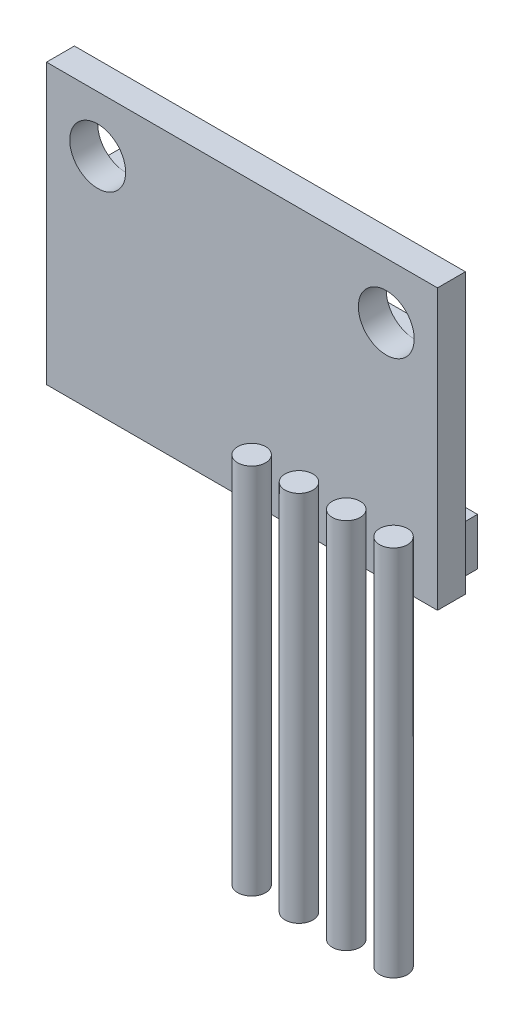
ISO-10303-21;
HEADER;
FILE_DESCRIPTION(('STEP AP214'),'2;1');
FILE_NAME('part.step','',(''),(''),'','','');
FILE_SCHEMA(('AUTOMOTIVE_DESIGN { 1 0 10303 214 1 1 1 1 }'));
ENDSEC;
DATA;
#1=APPLICATION_CONTEXT('core data for automotive mechanical design processes');
#2=APPLICATION_PROTOCOL_DEFINITION('international standard','automotive_design',2000,#1);
#3=PRODUCT_CONTEXT('',#1,'mechanical');
#4=PRODUCT('Part','Part','',(#3));
#5=PRODUCT_RELATED_PRODUCT_CATEGORY('part','',(#4));
#6=PRODUCT_DEFINITION_FORMATION('','',#4);
#7=PRODUCT_DEFINITION_CONTEXT('part definition',#1,'design');
#8=PRODUCT_DEFINITION('design','',#6,#7);
#9=PRODUCT_DEFINITION_SHAPE('','',#8);
#10=(LENGTH_UNIT() NAMED_UNIT(*) SI_UNIT(.MILLI.,.METRE.));
#11=(NAMED_UNIT(*) PLANE_ANGLE_UNIT() SI_UNIT($,.RADIAN.));
#12=(NAMED_UNIT(*) SI_UNIT($,.STERADIAN.) SOLID_ANGLE_UNIT());
#13=UNCERTAINTY_MEASURE_WITH_UNIT(LENGTH_MEASURE(1.E-05),#10,'distance_accuracy_value','');
#14=(GEOMETRIC_REPRESENTATION_CONTEXT(3) GLOBAL_UNCERTAINTY_ASSIGNED_CONTEXT((#13)) GLOBAL_UNIT_ASSIGNED_CONTEXT((#10,
#11,#12)) REPRESENTATION_CONTEXT('',''));
#15=CARTESIAN_POINT('',(0.,0.,0.));
#16=DIRECTION('',(0.,0.,1.));
#17=DIRECTION('',(1.,0.,0.));
#18=AXIS2_PLACEMENT_3D('',#15,#16,#17);
#19=CARTESIAN_POINT('',(1.27,-24.5,2.24999999999995));
#20=DIRECTION('',(0.,1.,0.));
#21=DIRECTION('',(0.,0.,1.));
#22=AXIS2_PLACEMENT_3D('',#19,#20,#21);
#23=CYLINDRICAL_SURFACE('',#22,0.75);
#24=CARTESIAN_POINT('',(1.27,-24.5,2.24999999999995));
#25=DIRECTION('',(0.,-1.,0.));
#26=DIRECTION('',(0.,0.,-1.));
#27=AXIS2_PLACEMENT_3D('',#24,#25,#26);
#28=CIRCLE('',#27,0.75);
#29=CARTESIAN_POINT('',(1.27,-24.5,1.49999999999995));
#30=VERTEX_POINT('',#29);
#31=EDGE_CURVE('E11',#30,#30,#28,.T.);
#32=ORIENTED_EDGE('',*,*,#31,.F.);
#33=EDGE_LOOP('',(#32));
#34=FACE_BOUND('',#33,.T.);
#35=CARTESIAN_POINT('',(1.27,-4.5,2.24999999999995));
#36=DIRECTION('',(0.,-1.,0.));
#37=DIRECTION('',(0.,0.,-1.));
#38=AXIS2_PLACEMENT_3D('',#35,#36,#37);
#39=CIRCLE('',#38,0.75);
#40=CARTESIAN_POINT('',(1.27,-4.5,1.49999999999995));
#41=VERTEX_POINT('',#40);
#42=EDGE_CURVE('E47',#41,#41,#39,.T.);
#43=ORIENTED_EDGE('',*,*,#42,.T.);
#44=EDGE_LOOP('',(#43));
#45=FACE_BOUND('',#44,.T.);
#46=ADVANCED_FACE('F44',(#34,#45),#23,.T.);
#47=CARTESIAN_POINT('',(1.27,-24.5,2.24999999999995));
#48=DIRECTION('',(0.,-1.,0.));
#49=DIRECTION('',(0.,0.,-1.));
#50=AXIS2_PLACEMENT_3D('',#47,#48,#49);
#51=PLANE('',#50);
#52=ORIENTED_EDGE('',*,*,#31,.T.);
#53=EDGE_LOOP('',(#52));
#54=FACE_BOUND('',#53,.T.);
#55=ADVANCED_FACE('F59',(#54),#51,.T.);
#56=CARTESIAN_POINT('',(1.27,-4.5,2.24999999999995));
#57=DIRECTION('',(0.,-1.,0.));
#58=DIRECTION('',(0.,0.,-1.));
#59=AXIS2_PLACEMENT_3D('',#56,#57,#58);
#60=PLANE('',#59);
#61=ORIENTED_EDGE('',*,*,#42,.F.);
#62=EDGE_LOOP('',(#61));
#63=FACE_BOUND('',#62,.T.);
#64=ADVANCED_FACE('F57',(#63),#60,.F.);
#65=CLOSED_SHELL('',(#46,#55,#64));
#66=MANIFOLD_SOLID_BREP('B2',#65);
#67=CARTESIAN_POINT('',(3.81,-24.5,2.24999999999996));
#68=DIRECTION('',(0.,1.,0.));
#69=DIRECTION('',(0.,0.,1.));
#70=AXIS2_PLACEMENT_3D('',#67,#68,#69);
#71=CYLINDRICAL_SURFACE('',#70,0.75);
#72=CARTESIAN_POINT('',(3.81,-24.5,2.24999999999996));
#73=DIRECTION('',(0.,-1.,0.));
#74=DIRECTION('',(0.,0.,-1.));
#75=AXIS2_PLACEMENT_3D('',#72,#73,#74);
#76=CIRCLE('',#75,0.75);
#77=CARTESIAN_POINT('',(3.81,-24.5,1.49999999999996));
#78=VERTEX_POINT('',#77);
#79=EDGE_CURVE('E43',#78,#78,#76,.T.);
#80=ORIENTED_EDGE('',*,*,#79,.F.);
#81=EDGE_LOOP('',(#80));
#82=FACE_BOUND('',#81,.T.);
#83=CARTESIAN_POINT('',(3.81,-4.5,2.24999999999996));
#84=DIRECTION('',(0.,-1.,0.));
#85=DIRECTION('',(0.,0.,-1.));
#86=AXIS2_PLACEMENT_3D('',#83,#84,#85);
#87=CIRCLE('',#86,0.75);
#88=CARTESIAN_POINT('',(3.81,-4.5,1.49999999999996));
#89=VERTEX_POINT('',#88);
#90=EDGE_CURVE('E96',#89,#89,#87,.T.);
#91=ORIENTED_EDGE('',*,*,#90,.T.);
#92=EDGE_LOOP('',(#91));
#93=FACE_BOUND('',#92,.T.);
#94=ADVANCED_FACE('F93',(#82,#93),#71,.T.);
#95=CARTESIAN_POINT('',(3.81,-24.5,2.24999999999996));
#96=DIRECTION('',(0.,-1.,0.));
#97=DIRECTION('',(0.,0.,-1.));
#98=AXIS2_PLACEMENT_3D('',#95,#96,#97);
#99=PLANE('',#98);
#100=ORIENTED_EDGE('',*,*,#79,.T.);
#101=EDGE_LOOP('',(#100));
#102=FACE_BOUND('',#101,.T.);
#103=ADVANCED_FACE('F108',(#102),#99,.T.);
#104=CARTESIAN_POINT('',(3.81,-4.5,2.24999999999996));
#105=DIRECTION('',(0.,-1.,0.));
#106=DIRECTION('',(0.,0.,-1.));
#107=AXIS2_PLACEMENT_3D('',#104,#105,#106);
#108=PLANE('',#107);
#109=ORIENTED_EDGE('',*,*,#90,.F.);
#110=EDGE_LOOP('',(#109));
#111=FACE_BOUND('',#110,.T.);
#112=ADVANCED_FACE('F106',(#111),#108,.F.);
#113=CLOSED_SHELL('',(#94,#103,#112));
#114=MANIFOLD_SOLID_BREP('B6',#113);
#115=CARTESIAN_POINT('',(6.35,-24.5,2.24999999999998));
#116=DIRECTION('',(0.,1.,0.));
#117=DIRECTION('',(0.,0.,1.));
#118=AXIS2_PLACEMENT_3D('',#115,#116,#117);
#119=CYLINDRICAL_SURFACE('',#118,0.75);
#120=CARTESIAN_POINT('',(6.35,-24.5,2.24999999999998));
#121=DIRECTION('',(0.,-1.,0.));
#122=DIRECTION('',(0.,0.,-1.));
#123=AXIS2_PLACEMENT_3D('',#120,#121,#122);
#124=CIRCLE('',#123,0.75);
#125=CARTESIAN_POINT('',(6.35,-24.5,1.49999999999998));
#126=VERTEX_POINT('',#125);
#127=EDGE_CURVE('E92',#126,#126,#124,.T.);
#128=ORIENTED_EDGE('',*,*,#127,.F.);
#129=EDGE_LOOP('',(#128));
#130=FACE_BOUND('',#129,.T.);
#131=CARTESIAN_POINT('',(6.35,-4.5,2.24999999999998));
#132=DIRECTION('',(0.,-1.,0.));
#133=DIRECTION('',(0.,0.,-1.));
#134=AXIS2_PLACEMENT_3D('',#131,#132,#133);
#135=CIRCLE('',#134,0.75);
#136=CARTESIAN_POINT('',(6.35,-4.5,1.49999999999998));
#137=VERTEX_POINT('',#136);
#138=EDGE_CURVE('E145',#137,#137,#135,.T.);
#139=ORIENTED_EDGE('',*,*,#138,.T.);
#140=EDGE_LOOP('',(#139));
#141=FACE_BOUND('',#140,.T.);
#142=ADVANCED_FACE('F142',(#130,#141),#119,.T.);
#143=CARTESIAN_POINT('',(6.35,-24.5,2.24999999999998));
#144=DIRECTION('',(0.,-1.,0.));
#145=DIRECTION('',(0.,0.,-1.));
#146=AXIS2_PLACEMENT_3D('',#143,#144,#145);
#147=PLANE('',#146);
#148=ORIENTED_EDGE('',*,*,#127,.T.);
#149=EDGE_LOOP('',(#148));
#150=FACE_BOUND('',#149,.T.);
#151=ADVANCED_FACE('F157',(#150),#147,.T.);
#152=CARTESIAN_POINT('',(6.35,-4.5,2.24999999999998));
#153=DIRECTION('',(0.,-1.,0.));
#154=DIRECTION('',(0.,0.,-1.));
#155=AXIS2_PLACEMENT_3D('',#152,#153,#154);
#156=PLANE('',#155);
#157=ORIENTED_EDGE('',*,*,#138,.F.);
#158=EDGE_LOOP('',(#157));
#159=FACE_BOUND('',#158,.T.);
#160=ADVANCED_FACE('F155',(#159),#156,.F.);
#161=CLOSED_SHELL('',(#142,#151,#160));
#162=MANIFOLD_SOLID_BREP('B38',#161);
#163=CARTESIAN_POINT('',(8.89,-24.5,2.25));
#164=DIRECTION('',(0.,1.,0.));
#165=DIRECTION('',(0.,0.,1.));
#166=AXIS2_PLACEMENT_3D('',#163,#164,#165);
#167=CYLINDRICAL_SURFACE('',#166,0.75);
#168=CARTESIAN_POINT('',(8.89,-24.5,2.25));
#169=DIRECTION('',(0.,-1.,0.));
#170=DIRECTION('',(0.,0.,-1.));
#171=AXIS2_PLACEMENT_3D('',#168,#169,#170);
#172=CIRCLE('',#171,0.75);
#173=CARTESIAN_POINT('',(8.89,-24.5,1.5));
#174=VERTEX_POINT('',#173);
#175=EDGE_CURVE('E141',#174,#174,#172,.T.);
#176=ORIENTED_EDGE('',*,*,#175,.F.);
#177=EDGE_LOOP('',(#176));
#178=FACE_BOUND('',#177,.T.);
#179=CARTESIAN_POINT('',(8.89,-4.5,2.25));
#180=DIRECTION('',(0.,-1.,0.));
#181=DIRECTION('',(0.,0.,-1.));
#182=AXIS2_PLACEMENT_3D('',#179,#180,#181);
#183=CIRCLE('',#182,0.75);
#184=CARTESIAN_POINT('',(8.89,-4.5,1.5));
#185=VERTEX_POINT('',#184);
#186=EDGE_CURVE('E195',#185,#185,#183,.T.);
#187=ORIENTED_EDGE('',*,*,#186,.T.);
#188=EDGE_LOOP('',(#187));
#189=FACE_BOUND('',#188,.T.);
#190=ADVANCED_FACE('F192',(#178,#189),#167,.T.);
#191=CARTESIAN_POINT('',(8.89,-24.5,2.25));
#192=DIRECTION('',(0.,-1.,0.));
#193=DIRECTION('',(0.,0.,-1.));
#194=AXIS2_PLACEMENT_3D('',#191,#192,#193);
#195=PLANE('',#194);
#196=ORIENTED_EDGE('',*,*,#175,.T.);
#197=EDGE_LOOP('',(#196));
#198=FACE_BOUND('',#197,.T.);
#199=ADVANCED_FACE('F207',(#198),#195,.T.);
#200=CARTESIAN_POINT('',(8.89,-4.5,2.25));
#201=DIRECTION('',(0.,-1.,0.));
#202=DIRECTION('',(0.,0.,-1.));
#203=AXIS2_PLACEMENT_3D('',#200,#201,#202);
#204=PLANE('',#203);
#205=ORIENTED_EDGE('',*,*,#186,.F.);
#206=EDGE_LOOP('',(#205));
#207=FACE_BOUND('',#206,.T.);
#208=ADVANCED_FACE('F205',(#207),#204,.F.);
#209=CLOSED_SHELL('',(#190,#199,#208));
#210=MANIFOLD_SOLID_BREP('B87',#209);
#211=CARTESIAN_POINT('',(0.,0.,0.));
#212=DIRECTION('',(0.,0.,1.));
#213=DIRECTION('',(1.,0.,0.));
#214=AXIS2_PLACEMENT_3D('',#211,#212,#213);
#215=PLANE('',#214);
#216=DIRECTION('',(0.,1.,0.));
#217=VECTOR('',#216,1.);
#218=CARTESIAN_POINT('',(-10.15,-4.46,0.));
#219=LINE('',#218,#217);
#220=CARTESIAN_POINT('',(-10.15,-7.,0.));
#221=VERTEX_POINT('',#220);
#222=CARTESIAN_POINT('',(-10.15,-4.46,0.));
#223=VERTEX_POINT('',#222);
#224=EDGE_CURVE('E373',#221,#223,#219,.T.);
#225=ORIENTED_EDGE('',*,*,#224,.F.);
#226=DIRECTION('',(-1.,0.,0.));
#227=VECTOR('',#226,1.);
#228=CARTESIAN_POINT('',(10.15,-7.,0.));
#229=LINE('',#228,#227);
#230=CARTESIAN_POINT('',(10.15,-7.,0.));
#231=VERTEX_POINT('',#230);
#232=EDGE_CURVE('E386',#231,#221,#229,.T.);
#233=ORIENTED_EDGE('',*,*,#232,.F.);
#234=DIRECTION('',(0.,-1.,0.));
#235=VECTOR('',#234,1.);
#236=CARTESIAN_POINT('',(10.15,-4.46,0.));
#237=LINE('',#236,#235);
#238=CARTESIAN_POINT('',(10.15,-4.46,0.));
#239=VERTEX_POINT('',#238);
#240=EDGE_CURVE('E395',#239,#231,#237,.T.);
#241=ORIENTED_EDGE('',*,*,#240,.F.);
#242=DIRECTION('',(1.,0.,0.));
#243=VECTOR('',#242,1.);
#244=CARTESIAN_POINT('',(10.15,-4.46,0.));
#245=LINE('',#244,#243);
#246=EDGE_CURVE('E376',#223,#239,#245,.T.);
#247=ORIENTED_EDGE('',*,*,#246,.F.);
#248=EDGE_LOOP('',(#225,#233,#241,#247));
#249=FACE_BOUND('',#248,.T.);
#250=DIRECTION('',(0.,1.,0.));
#251=VECTOR('',#250,1.);
#252=CARTESIAN_POINT('',(10.5,7.5,0.));
#253=LINE('',#252,#251);
#254=CARTESIAN_POINT('',(10.5,-7.5,0.));
#255=VERTEX_POINT('',#254);
#256=CARTESIAN_POINT('',(10.5,7.5,0.));
#257=VERTEX_POINT('',#256);
#258=EDGE_CURVE('E415',#255,#257,#253,.T.);
#259=ORIENTED_EDGE('',*,*,#258,.F.);
#260=DIRECTION('',(1.,0.,0.));
#261=VECTOR('',#260,1.);
#262=CARTESIAN_POINT('',(-10.5,-7.5,0.));
#263=LINE('',#262,#261);
#264=CARTESIAN_POINT('',(-10.5,-7.5,0.));
#265=VERTEX_POINT('',#264);
#266=EDGE_CURVE('E428',#265,#255,#263,.T.);
#267=ORIENTED_EDGE('',*,*,#266,.F.);
#268=DIRECTION('',(0.,-1.,0.));
#269=VECTOR('',#268,1.);
#270=CARTESIAN_POINT('',(-10.5,7.5,0.));
#271=LINE('',#270,#269);
#272=CARTESIAN_POINT('',(-10.5,7.5,0.));
#273=VERTEX_POINT('',#272);
#274=EDGE_CURVE('E439',#273,#265,#271,.T.);
#275=ORIENTED_EDGE('',*,*,#274,.F.);
#276=DIRECTION('',(-1.,0.,0.));
#277=VECTOR('',#276,1.);
#278=CARTESIAN_POINT('',(-10.5,7.5,0.));
#279=LINE('',#278,#277);
#280=EDGE_CURVE('E437',#257,#273,#279,.T.);
#281=ORIENTED_EDGE('',*,*,#280,.F.);
#282=EDGE_LOOP('',(#259,#267,#275,#281));
#283=FACE_BOUND('',#282,.T.);
#284=DIRECTION('',(0.,-1.,0.));
#285=VECTOR('',#284,1.);
#286=CARTESIAN_POINT('',(9.00000000000001,3.,0.));
#287=LINE('',#286,#285);
#288=CARTESIAN_POINT('',(9.00000000000001,3.,0.));
#289=VERTEX_POINT('',#288);
#290=CARTESIAN_POINT('',(9.00000000000001,-1.,0.));
#291=VERTEX_POINT('',#290);
#292=EDGE_CURVE('E372',#289,#291,#287,.T.);
#293=ORIENTED_EDGE('',*,*,#292,.F.);
#294=DIRECTION('',(1.,0.,0.));
#295=VECTOR('',#294,1.);
#296=CARTESIAN_POINT('',(9.00000000000001,3.,0.));
#297=LINE('',#296,#295);
#298=CARTESIAN_POINT('',(7.75,3.,0.));
#299=VERTEX_POINT('',#298);
#300=EDGE_CURVE('E678',#299,#289,#297,.T.);
#301=ORIENTED_EDGE('',*,*,#300,.F.);
#302=CARTESIAN_POINT('',(7.75,4.5,0.));
#303=DIRECTION('',(0.,0.,1.));
#304=DIRECTION('',(-1.,0.,0.));
#305=AXIS2_PLACEMENT_3D('',#302,#303,#304);
#306=CIRCLE('',#305,1.5);
#307=EDGE_CURVE('E419',#299,#299,#306,.T.);
#308=ORIENTED_EDGE('',*,*,#307,.T.);
#309=CARTESIAN_POINT('',(4.,3.,0.));
#310=VERTEX_POINT('',#309);
#311=EDGE_CURVE('E369',#310,#299,#297,.T.);
#312=ORIENTED_EDGE('',*,*,#311,.F.);
#313=DIRECTION('',(0.,-1.,0.));
#314=VECTOR('',#313,1.);
#315=CARTESIAN_POINT('',(4.,6.,0.));
#316=LINE('',#315,#314);
#317=CARTESIAN_POINT('',(4.,6.,0.));
#318=VERTEX_POINT('',#317);
#319=EDGE_CURVE('E683',#318,#310,#316,.T.);
#320=ORIENTED_EDGE('',*,*,#319,.F.);
#321=DIRECTION('',(1.,0.,0.));
#322=VECTOR('',#321,1.);
#323=CARTESIAN_POINT('',(4.,6.,0.));
#324=LINE('',#323,#322);
#325=CARTESIAN_POINT('',(-4.,6.,0.));
#326=VERTEX_POINT('',#325);
#327=EDGE_CURVE('E714',#326,#318,#324,.T.);
#328=ORIENTED_EDGE('',*,*,#327,.F.);
#329=DIRECTION('',(0.,1.,0.));
#330=VECTOR('',#329,1.);
#331=CARTESIAN_POINT('',(-4.,6.,0.));
#332=LINE('',#331,#330);
#333=CARTESIAN_POINT('',(-4.,3.,0.));
#334=VERTEX_POINT('',#333);
#335=EDGE_CURVE('E712',#334,#326,#332,.T.);
#336=ORIENTED_EDGE('',*,*,#335,.F.);
#337=DIRECTION('',(1.,0.,0.));
#338=VECTOR('',#337,1.);
#339=CARTESIAN_POINT('',(-4.,3.,0.));
#340=LINE('',#339,#338);
#341=CARTESIAN_POINT('',(-7.75,3.,0.));
#342=VERTEX_POINT('',#341);
#343=EDGE_CURVE('E706',#342,#334,#340,.T.);
#344=ORIENTED_EDGE('',*,*,#343,.F.);
#345=CARTESIAN_POINT('',(-7.75,4.5,0.));
#346=DIRECTION('',(0.,0.,1.));
#347=DIRECTION('',(1.,0.,0.));
#348=AXIS2_PLACEMENT_3D('',#345,#346,#347);
#349=CIRCLE('',#348,1.5);
#350=EDGE_CURVE('E412',#342,#342,#349,.T.);
#351=ORIENTED_EDGE('',*,*,#350,.T.);
#352=CARTESIAN_POINT('',(-9.00000000000001,3.,0.));
#353=VERTEX_POINT('',#352);
#354=EDGE_CURVE('E703',#353,#342,#340,.T.);
#355=ORIENTED_EDGE('',*,*,#354,.F.);
#356=DIRECTION('',(0.,1.,0.));
#357=VECTOR('',#356,1.);
#358=CARTESIAN_POINT('',(-9.00000000000001,3.,0.));
#359=LINE('',#358,#357);
#360=CARTESIAN_POINT('',(-9.00000000000001,-1.,0.));
#361=VERTEX_POINT('',#360);
#362=EDGE_CURVE('E253',#361,#353,#359,.T.);
#363=ORIENTED_EDGE('',*,*,#362,.F.);
#364=DIRECTION('',(-1.,0.,0.));
#365=VECTOR('',#364,1.);
#366=CARTESIAN_POINT('',(9.00000000000001,-1.,0.));
#367=LINE('',#366,#365);
#368=EDGE_CURVE('E248',#291,#361,#367,.T.);
#369=ORIENTED_EDGE('',*,*,#368,.F.);
#370=EDGE_LOOP('',(#293,#301,#308,#312,#320,#328,#336,#344,#351,#355,#363,#369));
#371=FACE_BOUND('',#370,.T.);
#372=ADVANCED_FACE('F233',(#249,#283,#371),#215,.F.);
#373=CARTESIAN_POINT('',(10.5,7.5,1.5));
#374=DIRECTION('',(-1.,0.,0.));
#375=DIRECTION('',(0.,-1.,0.));
#376=AXIS2_PLACEMENT_3D('',#373,#374,#375);
#377=PLANE('',#376);
#378=ORIENTED_EDGE('',*,*,#258,.T.);
#379=DIRECTION('',(0.,0.,-1.));
#380=VECTOR('',#379,1.);
#381=CARTESIAN_POINT('',(10.5,7.5,1.5));
#382=LINE('',#381,#380);
#383=CARTESIAN_POINT('',(10.5,7.5,1.5));
#384=VERTEX_POINT('',#383);
#385=EDGE_CURVE('E190',#384,#257,#382,.T.);
#386=ORIENTED_EDGE('',*,*,#385,.F.);
#387=DIRECTION('',(0.,1.,0.));
#388=VECTOR('',#387,1.);
#389=CARTESIAN_POINT('',(10.5,7.5,1.5));
#390=LINE('',#389,#388);
#391=CARTESIAN_POINT('',(10.5,-7.5,1.5));
#392=VERTEX_POINT('',#391);
#393=EDGE_CURVE('E424',#392,#384,#390,.T.);
#394=ORIENTED_EDGE('',*,*,#393,.F.);
#395=DIRECTION('',(0.,0.,-1.));
#396=VECTOR('',#395,1.);
#397=CARTESIAN_POINT('',(10.5,-7.5,1.5));
#398=LINE('',#397,#396);
#399=EDGE_CURVE('E434',#392,#255,#398,.T.);
#400=ORIENTED_EDGE('',*,*,#399,.T.);
#401=EDGE_LOOP('',(#378,#386,#394,#400));
#402=FACE_BOUND('',#401,.T.);
#403=ADVANCED_FACE('F235',(#402),#377,.F.);
#404=CARTESIAN_POINT('',(-10.5,7.5,1.5));
#405=DIRECTION('',(0.,-1.,0.));
#406=DIRECTION('',(0.,0.,-1.));
#407=AXIS2_PLACEMENT_3D('',#404,#405,#406);
#408=PLANE('',#407);
#409=ORIENTED_EDGE('',*,*,#280,.T.);
#410=DIRECTION('',(0.,0.,-1.));
#411=VECTOR('',#410,1.);
#412=CARTESIAN_POINT('',(-10.5,7.5,1.5));
#413=LINE('',#412,#411);
#414=CARTESIAN_POINT('',(-10.5,7.5,1.5));
#415=VERTEX_POINT('',#414);
#416=EDGE_CURVE('E241',#415,#273,#413,.T.);
#417=ORIENTED_EDGE('',*,*,#416,.F.);
#418=DIRECTION('',(-1.,0.,0.));
#419=VECTOR('',#418,1.);
#420=CARTESIAN_POINT('',(-10.5,7.5,1.5));
#421=LINE('',#420,#419);
#422=EDGE_CURVE('E427',#384,#415,#421,.T.);
#423=ORIENTED_EDGE('',*,*,#422,.F.);
#424=ORIENTED_EDGE('',*,*,#385,.T.);
#425=EDGE_LOOP('',(#409,#417,#423,#424));
#426=FACE_BOUND('',#425,.T.);
#427=ADVANCED_FACE('F466',(#426),#408,.F.);
#428=CARTESIAN_POINT('',(-10.5,7.5,1.5));
#429=DIRECTION('',(1.,0.,0.));
#430=DIRECTION('',(0.,1.,0.));
#431=AXIS2_PLACEMENT_3D('',#428,#429,#430);
#432=PLANE('',#431);
#433=ORIENTED_EDGE('',*,*,#274,.T.);
#434=DIRECTION('',(0.,0.,-1.));
#435=VECTOR('',#434,1.);
#436=CARTESIAN_POINT('',(-10.5,-7.5,1.5));
#437=LINE('',#436,#435);
#438=CARTESIAN_POINT('',(-10.5,-7.5,1.5));
#439=VERTEX_POINT('',#438);
#440=EDGE_CURVE('E444',#439,#265,#437,.T.);
#441=ORIENTED_EDGE('',*,*,#440,.F.);
#442=DIRECTION('',(0.,-1.,0.));
#443=VECTOR('',#442,1.);
#444=CARTESIAN_POINT('',(-10.5,7.5,1.5));
#445=LINE('',#444,#443);
#446=EDGE_CURVE('E430',#415,#439,#445,.T.);
#447=ORIENTED_EDGE('',*,*,#446,.F.);
#448=ORIENTED_EDGE('',*,*,#416,.T.);
#449=EDGE_LOOP('',(#433,#441,#447,#448));
#450=FACE_BOUND('',#449,.T.);
#451=ADVANCED_FACE('F451',(#450),#432,.F.);
#452=CARTESIAN_POINT('',(-10.5,-7.5,1.5));
#453=DIRECTION('',(0.,1.,0.));
#454=DIRECTION('',(0.,0.,1.));
#455=AXIS2_PLACEMENT_3D('',#452,#453,#454);
#456=PLANE('',#455);
#457=ORIENTED_EDGE('',*,*,#266,.T.);
#458=ORIENTED_EDGE('',*,*,#399,.F.);
#459=DIRECTION('',(1.,0.,0.));
#460=VECTOR('',#459,1.);
#461=CARTESIAN_POINT('',(-10.5,-7.5,1.5));
#462=LINE('',#461,#460);
#463=EDGE_CURVE('E432',#439,#392,#462,.T.);
#464=ORIENTED_EDGE('',*,*,#463,.F.);
#465=ORIENTED_EDGE('',*,*,#440,.T.);
#466=EDGE_LOOP('',(#457,#458,#464,#465));
#467=FACE_BOUND('',#466,.T.);
#468=ADVANCED_FACE('F459',(#467),#456,.F.);
#469=CARTESIAN_POINT('',(0.,0.,1.5));
#470=DIRECTION('',(0.,0.,1.));
#471=DIRECTION('',(1.,0.,0.));
#472=AXIS2_PLACEMENT_3D('',#469,#470,#471);
#473=PLANE('',#472);
#474=CARTESIAN_POINT('',(-7.75,4.5,1.5));
#475=DIRECTION('',(0.,0.,1.));
#476=DIRECTION('',(1.,0.,0.));
#477=AXIS2_PLACEMENT_3D('',#474,#475,#476);
#478=CIRCLE('',#477,1.5);
#479=CARTESIAN_POINT('',(-6.25,4.5,1.5));
#480=VERTEX_POINT('',#479);
#481=EDGE_CURVE('E416',#480,#480,#478,.T.);
#482=ORIENTED_EDGE('',*,*,#481,.F.);
#483=EDGE_LOOP('',(#482));
#484=FACE_BOUND('',#483,.T.);
#485=CARTESIAN_POINT('',(7.75,4.5,1.5));
#486=DIRECTION('',(0.,0.,1.));
#487=DIRECTION('',(-1.,0.,0.));
#488=AXIS2_PLACEMENT_3D('',#485,#486,#487);
#489=CIRCLE('',#488,1.5);
#490=CARTESIAN_POINT('',(6.25,4.5,1.5));
#491=VERTEX_POINT('',#490);
#492=EDGE_CURVE('E411',#491,#491,#489,.T.);
#493=ORIENTED_EDGE('',*,*,#492,.F.);
#494=EDGE_LOOP('',(#493));
#495=FACE_BOUND('',#494,.T.);
#496=ORIENTED_EDGE('',*,*,#393,.T.);
#497=ORIENTED_EDGE('',*,*,#422,.T.);
#498=ORIENTED_EDGE('',*,*,#446,.T.);
#499=ORIENTED_EDGE('',*,*,#463,.T.);
#500=EDGE_LOOP('',(#496,#497,#498,#499));
#501=FACE_BOUND('',#500,.T.);
#502=ADVANCED_FACE('F465',(#484,#495,#501),#473,.T.);
#503=CARTESIAN_POINT('',(7.75,4.5,0.));
#504=DIRECTION('',(0.,0.,1.));
#505=DIRECTION('',(1.,0.,0.));
#506=AXIS2_PLACEMENT_3D('',#503,#504,#505);
#507=CYLINDRICAL_SURFACE('',#506,1.5);
#508=ORIENTED_EDGE('',*,*,#307,.F.);
#509=EDGE_LOOP('',(#508));
#510=FACE_BOUND('',#509,.T.);
#511=ORIENTED_EDGE('',*,*,#492,.T.);
#512=EDGE_LOOP('',(#511));
#513=FACE_BOUND('',#512,.T.);
#514=ADVANCED_FACE('F485',(#510,#513),#507,.F.);
#515=CARTESIAN_POINT('',(-7.75,4.5,0.));
#516=DIRECTION('',(0.,0.,1.));
#517=DIRECTION('',(1.,0.,0.));
#518=AXIS2_PLACEMENT_3D('',#515,#516,#517);
#519=CYLINDRICAL_SURFACE('',#518,1.5);
#520=ORIENTED_EDGE('',*,*,#350,.F.);
#521=EDGE_LOOP('',(#520));
#522=FACE_BOUND('',#521,.T.);
#523=ORIENTED_EDGE('',*,*,#481,.T.);
#524=EDGE_LOOP('',(#523));
#525=FACE_BOUND('',#524,.T.);
#526=ADVANCED_FACE('F490',(#522,#525),#519,.F.);
#527=CARTESIAN_POINT('',(-10.15,-4.46,-1.));
#528=DIRECTION('',(1.,0.,0.));
#529=DIRECTION('',(0.,0.,-1.));
#530=AXIS2_PLACEMENT_3D('',#527,#528,#529);
#531=PLANE('',#530);
#532=ORIENTED_EDGE('',*,*,#224,.T.);
#533=DIRECTION('',(0.,0.,1.));
#534=VECTOR('',#533,1.);
#535=CARTESIAN_POINT('',(-10.15,-4.46,-1.));
#536=LINE('',#535,#534);
#537=CARTESIAN_POINT('',(-10.15,-4.46,-1.));
#538=VERTEX_POINT('',#537);
#539=EDGE_CURVE('E408',#538,#223,#536,.T.);
#540=ORIENTED_EDGE('',*,*,#539,.F.);
#541=DIRECTION('',(0.,1.,0.));
#542=VECTOR('',#541,1.);
#543=CARTESIAN_POINT('',(-10.15,-4.46,-1.));
#544=LINE('',#543,#542);
#545=CARTESIAN_POINT('',(-10.15,-7.,-1.));
#546=VERTEX_POINT('',#545);
#547=EDGE_CURVE('E382',#546,#538,#544,.T.);
#548=ORIENTED_EDGE('',*,*,#547,.F.);
#549=DIRECTION('',(0.,0.,1.));
#550=VECTOR('',#549,1.);
#551=CARTESIAN_POINT('',(-10.15,-7.,-1.));
#552=LINE('',#551,#550);
#553=EDGE_CURVE('E391',#546,#221,#552,.T.);
#554=ORIENTED_EDGE('',*,*,#553,.T.);
#555=EDGE_LOOP('',(#532,#540,#548,#554));
#556=FACE_BOUND('',#555,.T.);
#557=ADVANCED_FACE('F498',(#556),#531,.F.);
#558=CARTESIAN_POINT('',(10.15,-4.46,-1.));
#559=DIRECTION('',(0.,-1.,0.));
#560=DIRECTION('',(0.,0.,-1.));
#561=AXIS2_PLACEMENT_3D('',#558,#559,#560);
#562=PLANE('',#561);
#563=ORIENTED_EDGE('',*,*,#246,.T.);
#564=DIRECTION('',(0.,0.,1.));
#565=VECTOR('',#564,1.);
#566=CARTESIAN_POINT('',(10.15,-4.46,-1.));
#567=LINE('',#566,#565);
#568=CARTESIAN_POINT('',(10.15,-4.46,-1.));
#569=VERTEX_POINT('',#568);
#570=EDGE_CURVE('E405',#569,#239,#567,.T.);
#571=ORIENTED_EDGE('',*,*,#570,.F.);
#572=DIRECTION('',(1.,0.,0.));
#573=VECTOR('',#572,1.);
#574=CARTESIAN_POINT('',(10.15,-4.46,-1.));
#575=LINE('',#574,#573);
#576=EDGE_CURVE('E385',#538,#569,#575,.T.);
#577=ORIENTED_EDGE('',*,*,#576,.F.);
#578=ORIENTED_EDGE('',*,*,#539,.T.);
#579=EDGE_LOOP('',(#563,#571,#577,#578));
#580=FACE_BOUND('',#579,.T.);
#581=ADVANCED_FACE('F504',(#580),#562,.F.);
#582=CARTESIAN_POINT('',(10.15,-4.46,-1.));
#583=DIRECTION('',(-1.,0.,0.));
#584=DIRECTION('',(0.,0.,1.));
#585=AXIS2_PLACEMENT_3D('',#582,#583,#584);
#586=PLANE('',#585);
#587=ORIENTED_EDGE('',*,*,#240,.T.);
#588=DIRECTION('',(0.,0.,1.));
#589=VECTOR('',#588,1.);
#590=CARTESIAN_POINT('',(10.15,-7.,-1.));
#591=LINE('',#590,#589);
#592=CARTESIAN_POINT('',(10.15,-7.,-1.));
#593=VERTEX_POINT('',#592);
#594=EDGE_CURVE('E402',#593,#231,#591,.T.);
#595=ORIENTED_EDGE('',*,*,#594,.F.);
#596=DIRECTION('',(0.,-1.,0.));
#597=VECTOR('',#596,1.);
#598=CARTESIAN_POINT('',(10.15,-4.46,-1.));
#599=LINE('',#598,#597);
#600=EDGE_CURVE('E388',#569,#593,#599,.T.);
#601=ORIENTED_EDGE('',*,*,#600,.F.);
#602=ORIENTED_EDGE('',*,*,#570,.T.);
#603=EDGE_LOOP('',(#587,#595,#601,#602));
#604=FACE_BOUND('',#603,.T.);
#605=ADVANCED_FACE('F511',(#604),#586,.F.);
#606=CARTESIAN_POINT('',(10.15,-7.,-1.));
#607=DIRECTION('',(0.,1.,0.));
#608=DIRECTION('',(0.,0.,1.));
#609=AXIS2_PLACEMENT_3D('',#606,#607,#608);
#610=PLANE('',#609);
#611=ORIENTED_EDGE('',*,*,#232,.T.);
#612=ORIENTED_EDGE('',*,*,#553,.F.);
#613=DIRECTION('',(-1.,0.,0.));
#614=VECTOR('',#613,1.);
#615=CARTESIAN_POINT('',(10.15,-7.,-1.));
#616=LINE('',#615,#614);
#617=EDGE_CURVE('E390',#593,#546,#616,.T.);
#618=ORIENTED_EDGE('',*,*,#617,.F.);
#619=ORIENTED_EDGE('',*,*,#594,.T.);
#620=EDGE_LOOP('',(#611,#612,#618,#619));
#621=FACE_BOUND('',#620,.T.);
#622=ADVANCED_FACE('F515',(#621),#610,.F.);
#623=CARTESIAN_POINT('',(0.,0.,-1.));
#624=DIRECTION('',(0.,0.,-1.));
#625=DIRECTION('',(-1.,0.,0.));
#626=AXIS2_PLACEMENT_3D('',#623,#624,#625);
#627=PLANE('',#626);
#628=ORIENTED_EDGE('',*,*,#547,.T.);
#629=ORIENTED_EDGE('',*,*,#576,.T.);
#630=ORIENTED_EDGE('',*,*,#600,.T.);
#631=ORIENTED_EDGE('',*,*,#617,.T.);
#632=EDGE_LOOP('',(#628,#629,#630,#631));
#633=FACE_BOUND('',#632,.T.);
#634=ADVANCED_FACE('F519',(#633),#627,.T.);
#635=CARTESIAN_POINT('',(9.00000000000001,3.,-1.));
#636=DIRECTION('',(-1.,0.,0.));
#637=DIRECTION('',(0.,0.,1.));
#638=AXIS2_PLACEMENT_3D('',#635,#636,#637);
#639=PLANE('',#638);
#640=ORIENTED_EDGE('',*,*,#292,.T.);
#641=DIRECTION('',(0.,0.,1.));
#642=VECTOR('',#641,1.);
#643=CARTESIAN_POINT('',(9.00000000000001,-1.,-1.));
#644=LINE('',#643,#642);
#645=CARTESIAN_POINT('',(9.00000000000001,-1.,-1.));
#646=VERTEX_POINT('',#645);
#647=EDGE_CURVE('E353',#646,#291,#644,.T.);
#648=ORIENTED_EDGE('',*,*,#647,.F.);
#649=DIRECTION('',(0.,-1.,0.));
#650=VECTOR('',#649,1.);
#651=CARTESIAN_POINT('',(9.00000000000001,3.,-1.));
#652=LINE('',#651,#650);
#653=CARTESIAN_POINT('',(9.00000000000001,3.,-1.));
#654=VERTEX_POINT('',#653);
#655=EDGE_CURVE('E360',#654,#646,#652,.T.);
#656=ORIENTED_EDGE('',*,*,#655,.F.);
#657=DIRECTION('',(0.,0.,1.));
#658=VECTOR('',#657,1.);
#659=CARTESIAN_POINT('',(9.00000000000001,3.,-1.));
#660=LINE('',#659,#658);
#661=EDGE_CURVE('E687',#654,#289,#660,.T.);
#662=ORIENTED_EDGE('',*,*,#661,.T.);
#663=EDGE_LOOP('',(#640,#648,#656,#662));
#664=FACE_BOUND('',#663,.T.);
#665=ADVANCED_FACE('F371',(#664),#639,.F.);
#666=CARTESIAN_POINT('',(9.00000000000001,-1.,-1.));
#667=DIRECTION('',(0.,1.,0.));
#668=DIRECTION('',(0.,0.,1.));
#669=AXIS2_PLACEMENT_3D('',#666,#667,#668);
#670=PLANE('',#669);
#671=ORIENTED_EDGE('',*,*,#368,.T.);
#672=DIRECTION('',(0.,0.,1.));
#673=VECTOR('',#672,1.);
#674=CARTESIAN_POINT('',(-9.00000000000001,-1.,-1.));
#675=LINE('',#674,#673);
#676=CARTESIAN_POINT('',(-9.00000000000001,-1.,-1.));
#677=VERTEX_POINT('',#676);
#678=EDGE_CURVE('E356',#677,#361,#675,.T.);
#679=ORIENTED_EDGE('',*,*,#678,.F.);
#680=DIRECTION('',(-1.,0.,0.));
#681=VECTOR('',#680,1.);
#682=CARTESIAN_POINT('',(9.00000000000001,-1.,-1.));
#683=LINE('',#682,#681);
#684=EDGE_CURVE('E349',#646,#677,#683,.T.);
#685=ORIENTED_EDGE('',*,*,#684,.F.);
#686=ORIENTED_EDGE('',*,*,#647,.T.);
#687=EDGE_LOOP('',(#671,#679,#685,#686));
#688=FACE_BOUND('',#687,.T.);
#689=ADVANCED_FACE('F351',(#688),#670,.F.);
#690=CARTESIAN_POINT('',(-9.00000000000001,3.,-1.));
#691=DIRECTION('',(1.,0.,0.));
#692=DIRECTION('',(0.,0.,-1.));
#693=AXIS2_PLACEMENT_3D('',#690,#691,#692);
#694=PLANE('',#693);
#695=ORIENTED_EDGE('',*,*,#362,.T.);
#696=DIRECTION('',(0.,0.,1.));
#697=VECTOR('',#696,1.);
#698=CARTESIAN_POINT('',(-9.00000000000001,3.,-1.));
#699=LINE('',#698,#697);
#700=CARTESIAN_POINT('',(-9.00000000000001,3.,-1.));
#701=VERTEX_POINT('',#700);
#702=EDGE_CURVE('E378',#701,#353,#699,.T.);
#703=ORIENTED_EDGE('',*,*,#702,.F.);
#704=DIRECTION('',(0.,1.,0.));
#705=VECTOR('',#704,1.);
#706=CARTESIAN_POINT('',(-9.00000000000001,3.,-1.));
#707=LINE('',#706,#705);
#708=EDGE_CURVE('E359',#677,#701,#707,.T.);
#709=ORIENTED_EDGE('',*,*,#708,.F.);
#710=ORIENTED_EDGE('',*,*,#678,.T.);
#711=EDGE_LOOP('',(#695,#703,#709,#710));
#712=FACE_BOUND('',#711,.T.);
#713=ADVANCED_FACE('F528',(#712),#694,.F.);
#714=CARTESIAN_POINT('',(-4.,3.,-1.));
#715=DIRECTION('',(0.,-1.,0.));
#716=DIRECTION('',(0.,0.,-1.));
#717=AXIS2_PLACEMENT_3D('',#714,#715,#716);
#718=PLANE('',#717);
#719=ORIENTED_EDGE('',*,*,#354,.T.);
#720=ORIENTED_EDGE('',*,*,#343,.T.);
#721=DIRECTION('',(0.,0.,1.));
#722=VECTOR('',#721,1.);
#723=CARTESIAN_POINT('',(-4.,3.,-1.));
#724=LINE('',#723,#722);
#725=CARTESIAN_POINT('',(-4.,3.,-1.));
#726=VERTEX_POINT('',#725);
#727=EDGE_CURVE('E696',#726,#334,#724,.T.);
#728=ORIENTED_EDGE('',*,*,#727,.F.);
#729=DIRECTION('',(1.,0.,0.));
#730=VECTOR('',#729,1.);
#731=CARTESIAN_POINT('',(-4.,3.,-1.));
#732=LINE('',#731,#730);
#733=EDGE_CURVE('E705',#701,#726,#732,.T.);
#734=ORIENTED_EDGE('',*,*,#733,.F.);
#735=ORIENTED_EDGE('',*,*,#702,.T.);
#736=EDGE_LOOP('',(#719,#720,#728,#734,#735));
#737=FACE_BOUND('',#736,.T.);
#738=ADVANCED_FACE('F531',(#737),#718,.F.);
#739=CARTESIAN_POINT('',(-4.,6.,-1.));
#740=DIRECTION('',(1.,0.,0.));
#741=DIRECTION('',(0.,0.,-1.));
#742=AXIS2_PLACEMENT_3D('',#739,#740,#741);
#743=PLANE('',#742);
#744=ORIENTED_EDGE('',*,*,#335,.T.);
#745=DIRECTION('',(0.,0.,1.));
#746=VECTOR('',#745,1.);
#747=CARTESIAN_POINT('',(-4.,6.,-1.));
#748=LINE('',#747,#746);
#749=CARTESIAN_POINT('',(-4.,6.,-1.));
#750=VERTEX_POINT('',#749);
#751=EDGE_CURVE('E693',#750,#326,#748,.T.);
#752=ORIENTED_EDGE('',*,*,#751,.F.);
#753=DIRECTION('',(0.,1.,0.));
#754=VECTOR('',#753,1.);
#755=CARTESIAN_POINT('',(-4.,6.,-1.));
#756=LINE('',#755,#754);
#757=EDGE_CURVE('E723',#726,#750,#756,.T.);
#758=ORIENTED_EDGE('',*,*,#757,.F.);
#759=ORIENTED_EDGE('',*,*,#727,.T.);
#760=EDGE_LOOP('',(#744,#752,#758,#759));
#761=FACE_BOUND('',#760,.T.);
#762=ADVANCED_FACE('F535',(#761),#743,.F.);
#763=CARTESIAN_POINT('',(4.,6.,-1.));
#764=DIRECTION('',(0.,-1.,0.));
#765=DIRECTION('',(0.,0.,-1.));
#766=AXIS2_PLACEMENT_3D('',#763,#764,#765);
#767=PLANE('',#766);
#768=ORIENTED_EDGE('',*,*,#327,.T.);
#769=DIRECTION('',(0.,0.,1.));
#770=VECTOR('',#769,1.);
#771=CARTESIAN_POINT('',(4.,6.,-1.));
#772=LINE('',#771,#770);
#773=CARTESIAN_POINT('',(4.,6.,-1.));
#774=VERTEX_POINT('',#773);
#775=EDGE_CURVE('E690',#774,#318,#772,.T.);
#776=ORIENTED_EDGE('',*,*,#775,.F.);
#777=DIRECTION('',(1.,0.,0.));
#778=VECTOR('',#777,1.);
#779=CARTESIAN_POINT('',(4.,6.,-1.));
#780=LINE('',#779,#778);
#781=EDGE_CURVE('E721',#750,#774,#780,.T.);
#782=ORIENTED_EDGE('',*,*,#781,.F.);
#783=ORIENTED_EDGE('',*,*,#751,.T.);
#784=EDGE_LOOP('',(#768,#776,#782,#783));
#785=FACE_BOUND('',#784,.T.);
#786=ADVANCED_FACE('F539',(#785),#767,.F.);
#787=CARTESIAN_POINT('',(4.,6.,-1.));
#788=DIRECTION('',(-1.,0.,0.));
#789=DIRECTION('',(0.,0.,1.));
#790=AXIS2_PLACEMENT_3D('',#787,#788,#789);
#791=PLANE('',#790);
#792=ORIENTED_EDGE('',*,*,#319,.T.);
#793=DIRECTION('',(0.,0.,1.));
#794=VECTOR('',#793,1.);
#795=CARTESIAN_POINT('',(4.,3.,-1.));
#796=LINE('',#795,#794);
#797=CARTESIAN_POINT('',(4.,3.,-1.));
#798=VERTEX_POINT('',#797);
#799=EDGE_CURVE('E680',#798,#310,#796,.T.);
#800=ORIENTED_EDGE('',*,*,#799,.F.);
#801=DIRECTION('',(0.,-1.,0.));
#802=VECTOR('',#801,1.);
#803=CARTESIAN_POINT('',(4.,6.,-1.));
#804=LINE('',#803,#802);
#805=EDGE_CURVE('E722',#774,#798,#804,.T.);
#806=ORIENTED_EDGE('',*,*,#805,.F.);
#807=ORIENTED_EDGE('',*,*,#775,.T.);
#808=EDGE_LOOP('',(#792,#800,#806,#807));
#809=FACE_BOUND('',#808,.T.);
#810=ADVANCED_FACE('F543',(#809),#791,.F.);
#811=CARTESIAN_POINT('',(9.00000000000001,3.,-1.));
#812=DIRECTION('',(0.,-1.,0.));
#813=DIRECTION('',(0.,0.,-1.));
#814=AXIS2_PLACEMENT_3D('',#811,#812,#813);
#815=PLANE('',#814);
#816=ORIENTED_EDGE('',*,*,#311,.T.);
#817=ORIENTED_EDGE('',*,*,#300,.T.);
#818=ORIENTED_EDGE('',*,*,#661,.F.);
#819=DIRECTION('',(1.,0.,0.));
#820=VECTOR('',#819,1.);
#821=CARTESIAN_POINT('',(9.00000000000001,3.,-1.));
#822=LINE('',#821,#820);
#823=EDGE_CURVE('E365',#798,#654,#822,.T.);
#824=ORIENTED_EDGE('',*,*,#823,.F.);
#825=ORIENTED_EDGE('',*,*,#799,.T.);
#826=EDGE_LOOP('',(#816,#817,#818,#824,#825));
#827=FACE_BOUND('',#826,.T.);
#828=ADVANCED_FACE('F547',(#827),#815,.F.);
#829=CARTESIAN_POINT('',(0.,0.,-1.));
#830=DIRECTION('',(0.,0.,-1.));
#831=DIRECTION('',(-1.,0.,0.));
#832=AXIS2_PLACEMENT_3D('',#829,#830,#831);
#833=PLANE('',#832);
#834=ORIENTED_EDGE('',*,*,#655,.T.);
#835=ORIENTED_EDGE('',*,*,#684,.T.);
#836=ORIENTED_EDGE('',*,*,#708,.T.);
#837=ORIENTED_EDGE('',*,*,#733,.T.);
#838=ORIENTED_EDGE('',*,*,#757,.T.);
#839=ORIENTED_EDGE('',*,*,#781,.T.);
#840=ORIENTED_EDGE('',*,*,#805,.T.);
#841=ORIENTED_EDGE('',*,*,#823,.T.);
#842=EDGE_LOOP('',(#834,#835,#836,#837,#838,#839,#840,#841));
#843=FACE_BOUND('',#842,.T.);
#844=ADVANCED_FACE('F363',(#843),#833,.T.);
#845=CLOSED_SHELL('',(#372,#403,#427,#451,#468,#502,#514,#526,#557,#581,#605,#622,#634,#665,
#689,#713,#738,#762,#786,#810,#828,#844));
#846=MANIFOLD_SOLID_BREP('B136',#845);
#847=ADVANCED_BREP_SHAPE_REPRESENTATION('',(#18,#66,#114,#162,#210,#846),#14);
#848=SHAPE_DEFINITION_REPRESENTATION(#9,#847);
ENDSEC;
END-ISO-10303-21;
